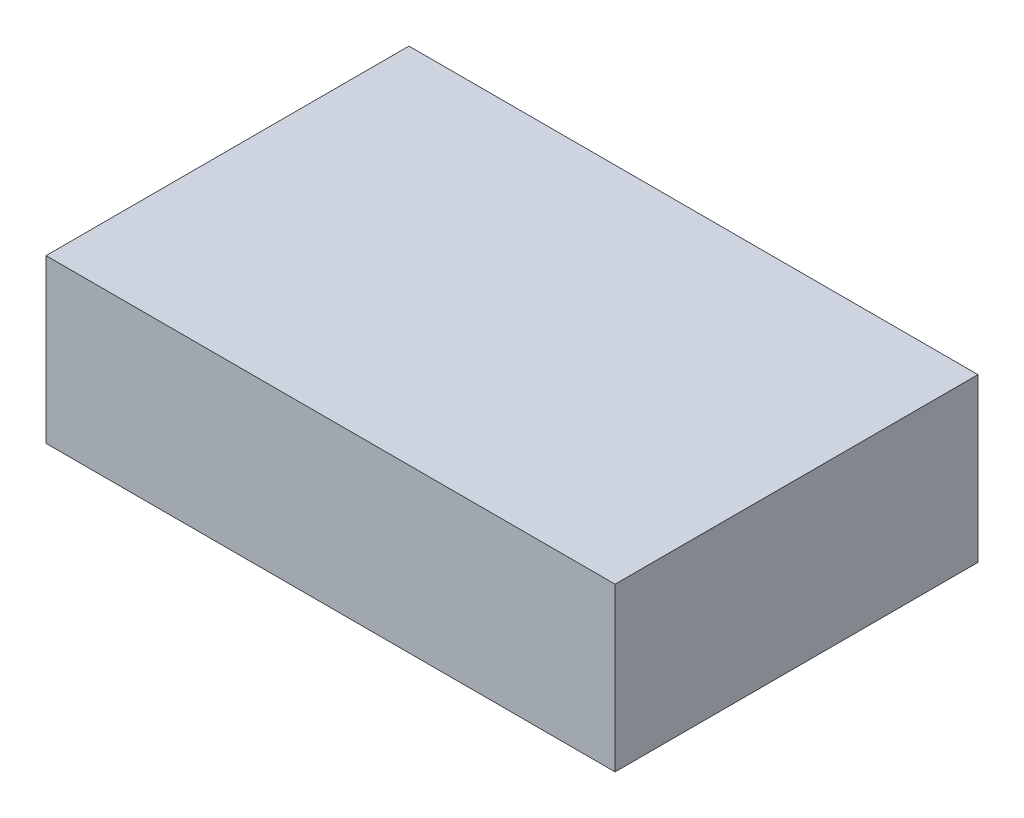
ISO-10303-21;
HEADER;
FILE_DESCRIPTION(('STEP AP214'),'2;1');
FILE_NAME('part.step','',(''),(''),'','','');
FILE_SCHEMA(('AUTOMOTIVE_DESIGN { 1 0 10303 214 1 1 1 1 }'));
ENDSEC;
DATA;
#1=APPLICATION_CONTEXT('core data for automotive mechanical design processes');
#2=APPLICATION_PROTOCOL_DEFINITION('international standard','automotive_design',2000,#1);
#3=PRODUCT_CONTEXT('',#1,'mechanical');
#4=PRODUCT('Part','Part','',(#3));
#5=PRODUCT_RELATED_PRODUCT_CATEGORY('part','',(#4));
#6=PRODUCT_DEFINITION_FORMATION('','',#4);
#7=PRODUCT_DEFINITION_CONTEXT('part definition',#1,'design');
#8=PRODUCT_DEFINITION('design','',#6,#7);
#9=PRODUCT_DEFINITION_SHAPE('','',#8);
#10=(LENGTH_UNIT() NAMED_UNIT(*) SI_UNIT(.MILLI.,.METRE.));
#11=(NAMED_UNIT(*) PLANE_ANGLE_UNIT() SI_UNIT($,.RADIAN.));
#12=(NAMED_UNIT(*) SI_UNIT($,.STERADIAN.) SOLID_ANGLE_UNIT());
#13=UNCERTAINTY_MEASURE_WITH_UNIT(LENGTH_MEASURE(1.E-05),#10,'distance_accuracy_value','');
#14=(GEOMETRIC_REPRESENTATION_CONTEXT(3) GLOBAL_UNCERTAINTY_ASSIGNED_CONTEXT((#13)) GLOBAL_UNIT_ASSIGNED_CONTEXT((#10,
#11,#12)) REPRESENTATION_CONTEXT('',''));
#15=CARTESIAN_POINT('',(0.,0.,0.));
#16=DIRECTION('',(0.,0.,1.));
#17=DIRECTION('',(1.,0.,0.));
#18=AXIS2_PLACEMENT_3D('',#15,#16,#17);
#19=CARTESIAN_POINT('',(-0.98,0.58,1.25));
#20=DIRECTION('',(1.,0.,0.));
#21=DIRECTION('',(0.,0.,-1.));
#22=AXIS2_PLACEMENT_3D('',#19,#20,#21);
#23=PLANE('',#22);
#24=DIRECTION('',(0.,-1.,0.));
#25=VECTOR('',#24,1.);
#26=CARTESIAN_POINT('',(-0.98,0.58,0.));
#27=LINE('',#26,#25);
#28=CARTESIAN_POINT('',(-0.98,0.58,0.));
#29=VERTEX_POINT('',#28);
#30=CARTESIAN_POINT('',(-0.98,0.0200000000000001,0.));
#31=VERTEX_POINT('',#30);
#32=EDGE_CURVE('E11',#29,#31,#27,.T.);
#33=ORIENTED_EDGE('',*,*,#32,.T.);
#34=DIRECTION('',(0.,0.,-1.));
#35=VECTOR('',#34,1.);
#36=CARTESIAN_POINT('',(-0.98,0.0200000000000001,1.25));
#37=LINE('',#36,#35);
#38=CARTESIAN_POINT('',(-0.98,0.0200000000000001,1.25));
#39=VERTEX_POINT('',#38);
#40=EDGE_CURVE('E24',#39,#31,#37,.T.);
#41=ORIENTED_EDGE('',*,*,#40,.F.);
#42=DIRECTION('',(0.,-1.,0.));
#43=VECTOR('',#42,1.);
#44=CARTESIAN_POINT('',(-0.98,0.58,1.25));
#45=LINE('',#44,#43);
#46=CARTESIAN_POINT('',(-0.98,0.58,1.25));
#47=VERTEX_POINT('',#46);
#48=EDGE_CURVE('E88',#47,#39,#45,.T.);
#49=ORIENTED_EDGE('',*,*,#48,.F.);
#50=DIRECTION('',(0.,0.,-1.));
#51=VECTOR('',#50,1.);
#52=CARTESIAN_POINT('',(-0.98,0.58,1.25));
#53=LINE('',#52,#51);
#54=EDGE_CURVE('E77',#47,#29,#53,.T.);
#55=ORIENTED_EDGE('',*,*,#54,.T.);
#56=EDGE_LOOP('',(#33,#41,#49,#55));
#57=FACE_BOUND('',#56,.T.);
#58=ADVANCED_FACE('F17',(#57),#23,.F.);
#59=CARTESIAN_POINT('',(-0.98,0.0200000000000001,1.25));
#60=DIRECTION('',(0.,1.,0.));
#61=DIRECTION('',(-1.,0.,0.));
#62=AXIS2_PLACEMENT_3D('',#59,#60,#61);
#63=PLANE('',#62);
#64=DIRECTION('',(1.,0.,0.));
#65=VECTOR('',#64,1.);
#66=CARTESIAN_POINT('',(-0.98,0.0200000000000001,0.));
#67=LINE('',#66,#65);
#68=CARTESIAN_POINT('',(0.98,0.0200000000000001,0.));
#69=VERTEX_POINT('',#68);
#70=EDGE_CURVE('E85',#31,#69,#67,.T.);
#71=ORIENTED_EDGE('',*,*,#70,.T.);
#72=DIRECTION('',(0.,0.,-1.));
#73=VECTOR('',#72,1.);
#74=CARTESIAN_POINT('',(0.98,0.0200000000000001,1.25));
#75=LINE('',#74,#73);
#76=CARTESIAN_POINT('',(0.98,0.0200000000000001,1.25));
#77=VERTEX_POINT('',#76);
#78=EDGE_CURVE('E83',#77,#69,#75,.T.);
#79=ORIENTED_EDGE('',*,*,#78,.F.);
#80=DIRECTION('',(1.,0.,0.));
#81=VECTOR('',#80,1.);
#82=CARTESIAN_POINT('',(-0.98,0.0200000000000001,1.25));
#83=LINE('',#82,#81);
#84=EDGE_CURVE('E72',#39,#77,#83,.T.);
#85=ORIENTED_EDGE('',*,*,#84,.F.);
#86=ORIENTED_EDGE('',*,*,#40,.T.);
#87=EDGE_LOOP('',(#71,#79,#85,#86));
#88=FACE_BOUND('',#87,.T.);
#89=ADVANCED_FACE('F90',(#88),#63,.F.);
#90=CARTESIAN_POINT('',(0.98,0.58,1.25));
#91=DIRECTION('',(-1.,0.,0.));
#92=DIRECTION('',(0.,0.,1.));
#93=AXIS2_PLACEMENT_3D('',#90,#91,#92);
#94=PLANE('',#93);
#95=DIRECTION('',(0.,1.,0.));
#96=VECTOR('',#95,1.);
#97=CARTESIAN_POINT('',(0.98,0.58,0.));
#98=LINE('',#97,#96);
#99=CARTESIAN_POINT('',(0.98,0.58,0.));
#100=VERTEX_POINT('',#99);
#101=EDGE_CURVE('E60',#69,#100,#98,.T.);
#102=ORIENTED_EDGE('',*,*,#101,.T.);
#103=DIRECTION('',(0.,0.,-1.));
#104=VECTOR('',#103,1.);
#105=CARTESIAN_POINT('',(0.98,0.58,1.25));
#106=LINE('',#105,#104);
#107=CARTESIAN_POINT('',(0.98,0.58,1.25));
#108=VERTEX_POINT('',#107);
#109=EDGE_CURVE('E54',#108,#100,#106,.T.);
#110=ORIENTED_EDGE('',*,*,#109,.F.);
#111=DIRECTION('',(0.,1.,0.));
#112=VECTOR('',#111,1.);
#113=CARTESIAN_POINT('',(0.98,0.58,1.25));
#114=LINE('',#113,#112);
#115=EDGE_CURVE('E58',#77,#108,#114,.T.);
#116=ORIENTED_EDGE('',*,*,#115,.F.);
#117=ORIENTED_EDGE('',*,*,#78,.T.);
#118=EDGE_LOOP('',(#102,#110,#116,#117));
#119=FACE_BOUND('',#118,.T.);
#120=ADVANCED_FACE('F56',(#119),#94,.F.);
#121=CARTESIAN_POINT('',(-0.98,0.58,1.25));
#122=DIRECTION('',(0.,-1.,0.));
#123=DIRECTION('',(0.,0.,-1.));
#124=AXIS2_PLACEMENT_3D('',#121,#122,#123);
#125=PLANE('',#124);
#126=DIRECTION('',(-1.,0.,0.));
#127=VECTOR('',#126,1.);
#128=CARTESIAN_POINT('',(-0.98,0.58,0.));
#129=LINE('',#128,#127);
#130=EDGE_CURVE('E73',#100,#29,#129,.T.);
#131=ORIENTED_EDGE('',*,*,#130,.T.);
#132=ORIENTED_EDGE('',*,*,#54,.F.);
#133=DIRECTION('',(-1.,0.,0.));
#134=VECTOR('',#133,1.);
#135=CARTESIAN_POINT('',(-0.98,0.58,1.25));
#136=LINE('',#135,#134);
#137=EDGE_CURVE('E70',#108,#47,#136,.T.);
#138=ORIENTED_EDGE('',*,*,#137,.F.);
#139=ORIENTED_EDGE('',*,*,#109,.T.);
#140=EDGE_LOOP('',(#131,#132,#138,#139));
#141=FACE_BOUND('',#140,.T.);
#142=ADVANCED_FACE('F76',(#141),#125,.F.);
#143=CARTESIAN_POINT('',(-0.98,0.0200000000000001,1.25));
#144=DIRECTION('',(0.,0.,1.));
#145=DIRECTION('',(1.,0.,0.));
#146=AXIS2_PLACEMENT_3D('',#143,#144,#145);
#147=PLANE('',#146);
#148=ORIENTED_EDGE('',*,*,#48,.T.);
#149=ORIENTED_EDGE('',*,*,#84,.T.);
#150=ORIENTED_EDGE('',*,*,#115,.T.);
#151=ORIENTED_EDGE('',*,*,#137,.T.);
#152=EDGE_LOOP('',(#148,#149,#150,#151));
#153=FACE_BOUND('',#152,.T.);
#154=ADVANCED_FACE('F69',(#153),#147,.T.);
#155=CARTESIAN_POINT('',(-0.98,0.0200000000000001,0.));
#156=DIRECTION('',(0.,0.,1.));
#157=DIRECTION('',(1.,0.,0.));
#158=AXIS2_PLACEMENT_3D('',#155,#156,#157);
#159=PLANE('',#158);
#160=ORIENTED_EDGE('',*,*,#32,.F.);
#161=ORIENTED_EDGE('',*,*,#130,.F.);
#162=ORIENTED_EDGE('',*,*,#101,.F.);
#163=ORIENTED_EDGE('',*,*,#70,.F.);
#164=EDGE_LOOP('',(#160,#161,#162,#163));
#165=FACE_BOUND('',#164,.T.);
#166=ADVANCED_FACE('F91',(#165),#159,.F.);
#167=CLOSED_SHELL('',(#58,#89,#120,#142,#154,#166));
#168=MANIFOLD_SOLID_BREP('B1',#167);
#169=ADVANCED_BREP_SHAPE_REPRESENTATION('',(#18,#168),#14);
#170=SHAPE_DEFINITION_REPRESENTATION(#9,#169);
ENDSEC;
END-ISO-10303-21;
